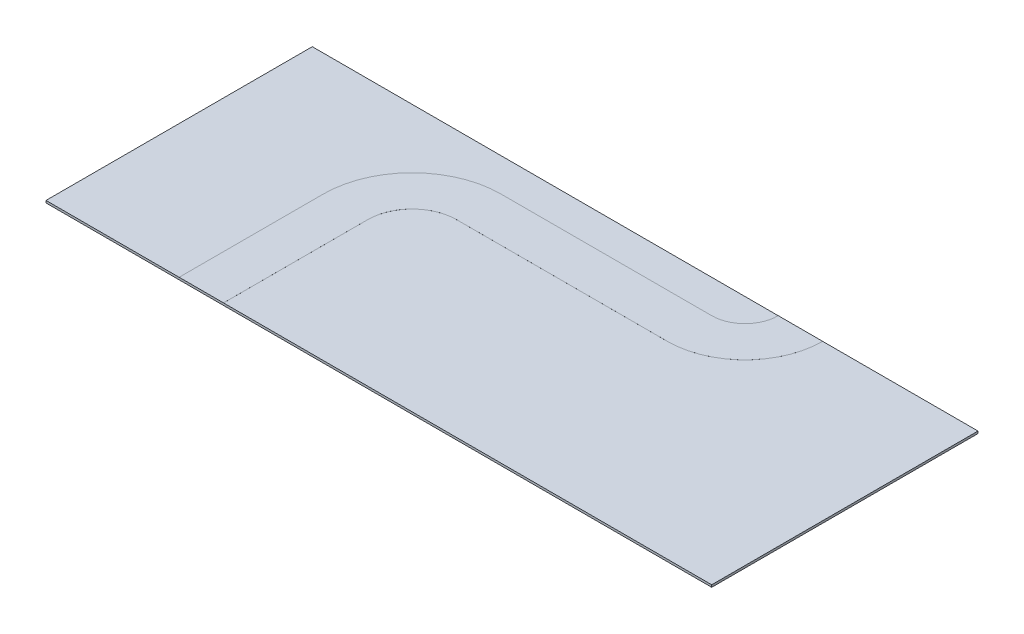
ISO-10303-21;
HEADER;
FILE_DESCRIPTION(('STEP AP214'),'2;1');
FILE_NAME('part.step','',(''),(''),'','','');
FILE_SCHEMA(('AUTOMOTIVE_DESIGN { 1 0 10303 214 1 1 1 1 }'));
ENDSEC;
DATA;
#1=APPLICATION_CONTEXT('core data for automotive mechanical design processes');
#2=APPLICATION_PROTOCOL_DEFINITION('international standard','automotive_design',2000,#1);
#3=PRODUCT_CONTEXT('',#1,'mechanical');
#4=PRODUCT('Part','Part','',(#3));
#5=PRODUCT_RELATED_PRODUCT_CATEGORY('part','',(#4));
#6=PRODUCT_DEFINITION_FORMATION('','',#4);
#7=PRODUCT_DEFINITION_CONTEXT('part definition',#1,'design');
#8=PRODUCT_DEFINITION('design','',#6,#7);
#9=PRODUCT_DEFINITION_SHAPE('','',#8);
#10=(LENGTH_UNIT() NAMED_UNIT(*) SI_UNIT(.MILLI.,.METRE.));
#11=(NAMED_UNIT(*) PLANE_ANGLE_UNIT() SI_UNIT($,.RADIAN.));
#12=(NAMED_UNIT(*) SI_UNIT($,.STERADIAN.) SOLID_ANGLE_UNIT());
#13=UNCERTAINTY_MEASURE_WITH_UNIT(LENGTH_MEASURE(1.E-05),#10,'distance_accuracy_value','');
#14=(GEOMETRIC_REPRESENTATION_CONTEXT(3) GLOBAL_UNCERTAINTY_ASSIGNED_CONTEXT((#13)) GLOBAL_UNIT_ASSIGNED_CONTEXT((#10,
#11,#12)) REPRESENTATION_CONTEXT('',''));
#15=CARTESIAN_POINT('',(0.,0.,0.));
#16=DIRECTION('',(0.,0.,1.));
#17=DIRECTION('',(1.,0.,0.));
#18=AXIS2_PLACEMENT_3D('',#15,#16,#17);
#19=CARTESIAN_POINT('',(0.,10.,0.));
#20=DIRECTION('',(0.,1.,0.));
#21=DIRECTION('',(0.,0.,1.));
#22=AXIS2_PLACEMENT_3D('',#19,#20,#21);
#23=PLANE('',#22);
#24=DIRECTION('',(0.,0.,1.));
#25=VECTOR('',#24,1.);
#26=CARTESIAN_POINT('',(-900.,10.,600.));
#27=LINE('',#26,#25);
#28=CARTESIAN_POINT('',(-900.,10.,-50.0000000000003));
#29=VERTEX_POINT('',#28);
#30=CARTESIAN_POINT('',(-900.,10.,600.));
#31=VERTEX_POINT('',#30);
#32=EDGE_CURVE('E48',#29,#31,#27,.T.);
#33=ORIENTED_EDGE('',*,*,#32,.F.);
#34=CARTESIAN_POINT('',(-500.,10.,-50.0000000000004));
#35=DIRECTION('',(0.,1.,0.));
#36=DIRECTION('',(0.,0.,-1.));
#37=AXIS2_PLACEMENT_3D('',#34,#35,#36);
#38=CIRCLE('',#37,400.);
#39=CARTESIAN_POINT('',(-500.,10.,-450.));
#40=VERTEX_POINT('',#39);
#41=EDGE_CURVE('E52',#40,#29,#38,.T.);
#42=ORIENTED_EDGE('',*,*,#41,.F.);
#43=DIRECTION('',(-1.,0.,0.));
#44=VECTOR('',#43,1.);
#45=CARTESIAN_POINT('',(-500.,10.,-450.));
#46=LINE('',#45,#44);
#47=CARTESIAN_POINT('',(450.,10.,-450.));
#48=VERTEX_POINT('',#47);
#49=EDGE_CURVE('E222',#48,#40,#46,.T.);
#50=ORIENTED_EDGE('',*,*,#49,.F.);
#51=CARTESIAN_POINT('',(450.,10.,-600.));
#52=DIRECTION('',(0.,-1.,0.));
#53=DIRECTION('',(0.,0.,1.));
#54=AXIS2_PLACEMENT_3D('',#51,#52,#53);
#55=CIRCLE('',#54,150.);
#56=CARTESIAN_POINT('',(600.,10.,-600.));
#57=VERTEX_POINT('',#56);
#58=EDGE_CURVE('E219',#57,#48,#55,.T.);
#59=ORIENTED_EDGE('',*,*,#58,.F.);
#60=DIRECTION('',(-1.,0.,0.));
#61=VECTOR('',#60,1.);
#62=CARTESIAN_POINT('',(-1500.,10.,-600.));
#63=LINE('',#62,#61);
#64=CARTESIAN_POINT('',(-1500.,10.,-600.));
#65=VERTEX_POINT('',#64);
#66=EDGE_CURVE('E169',#57,#65,#63,.T.);
#67=ORIENTED_EDGE('',*,*,#66,.T.);
#68=DIRECTION('',(0.,0.,1.));
#69=VECTOR('',#68,1.);
#70=CARTESIAN_POINT('',(-1500.,10.,-600.));
#71=LINE('',#70,#69);
#72=CARTESIAN_POINT('',(-1500.,10.,600.));
#73=VERTEX_POINT('',#72);
#74=EDGE_CURVE('E173',#65,#73,#71,.T.);
#75=ORIENTED_EDGE('',*,*,#74,.T.);
#76=DIRECTION('',(1.,0.,0.));
#77=VECTOR('',#76,1.);
#78=CARTESIAN_POINT('',(-1500.,10.,600.));
#79=LINE('',#78,#77);
#80=EDGE_CURVE('E175',#73,#31,#79,.T.);
#81=ORIENTED_EDGE('',*,*,#80,.T.);
#82=EDGE_LOOP('',(#33,#42,#50,#59,#67,#75,#81));
#83=FACE_BOUND('',#82,.T.);
#84=ADVANCED_FACE('F33',(#83),#23,.T.);
#85=CARTESIAN_POINT('',(1500.,10.,-600.));
#86=DIRECTION('',(-1.,0.,0.));
#87=DIRECTION('',(0.,0.,1.));
#88=AXIS2_PLACEMENT_3D('',#85,#86,#87);
#89=PLANE('',#88);
#90=DIRECTION('',(0.,0.,-1.));
#91=VECTOR('',#90,1.);
#92=CARTESIAN_POINT('',(1500.,0.,-600.));
#93=LINE('',#92,#91);
#94=CARTESIAN_POINT('',(1500.,0.,600.));
#95=VERTEX_POINT('',#94);
#96=CARTESIAN_POINT('',(1500.,0.,-600.));
#97=VERTEX_POINT('',#96);
#98=EDGE_CURVE('E157',#95,#97,#93,.T.);
#99=ORIENTED_EDGE('',*,*,#98,.T.);
#100=DIRECTION('',(0.,-1.,0.));
#101=VECTOR('',#100,1.);
#102=CARTESIAN_POINT('',(1500.,10.,-600.));
#103=LINE('',#102,#101);
#104=CARTESIAN_POINT('',(1500.,10.,-600.));
#105=VERTEX_POINT('',#104);
#106=EDGE_CURVE('E11',#105,#97,#103,.T.);
#107=ORIENTED_EDGE('',*,*,#106,.F.);
#108=DIRECTION('',(0.,0.,-1.));
#109=VECTOR('',#108,1.);
#110=CARTESIAN_POINT('',(1500.,10.,-600.));
#111=LINE('',#110,#109);
#112=CARTESIAN_POINT('',(1500.,10.,600.));
#113=VERTEX_POINT('',#112);
#114=EDGE_CURVE('E166',#113,#105,#111,.T.);
#115=ORIENTED_EDGE('',*,*,#114,.F.);
#116=DIRECTION('',(0.,-1.,0.));
#117=VECTOR('',#116,1.);
#118=CARTESIAN_POINT('',(1500.,10.,600.));
#119=LINE('',#118,#117);
#120=EDGE_CURVE('E176',#113,#95,#119,.T.);
#121=ORIENTED_EDGE('',*,*,#120,.T.);
#122=EDGE_LOOP('',(#99,#107,#115,#121));
#123=FACE_BOUND('',#122,.T.);
#124=ADVANCED_FACE('F35',(#123),#89,.F.);
#125=CARTESIAN_POINT('',(-1500.,10.,-600.));
#126=DIRECTION('',(0.,0.,1.));
#127=DIRECTION('',(1.,0.,0.));
#128=AXIS2_PLACEMENT_3D('',#125,#126,#127);
#129=PLANE('',#128);
#130=DIRECTION('',(-1.,0.,0.));
#131=VECTOR('',#130,1.);
#132=CARTESIAN_POINT('',(-1500.,0.,-600.));
#133=LINE('',#132,#131);
#134=CARTESIAN_POINT('',(-1500.,0.,-600.));
#135=VERTEX_POINT('',#134);
#136=EDGE_CURVE('E160',#97,#135,#133,.T.);
#137=ORIENTED_EDGE('',*,*,#136,.T.);
#138=DIRECTION('',(0.,-1.,0.));
#139=VECTOR('',#138,1.);
#140=CARTESIAN_POINT('',(-1500.,10.,-600.));
#141=LINE('',#140,#139);
#142=EDGE_CURVE('E41',#65,#135,#141,.T.);
#143=ORIENTED_EDGE('',*,*,#142,.F.);
#144=ORIENTED_EDGE('',*,*,#66,.F.);
#145=DIRECTION('',(0.,-1.,0.));
#146=VECTOR('',#145,1.);
#147=CARTESIAN_POINT('',(600.,10.1,-600.));
#148=LINE('',#147,#146);
#149=CARTESIAN_POINT('',(600.,10.1,-600.));
#150=VERTEX_POINT('',#149);
#151=EDGE_CURVE('E237',#150,#57,#148,.T.);
#152=ORIENTED_EDGE('',*,*,#151,.F.);
#153=DIRECTION('',(-1.,0.,0.));
#154=VECTOR('',#153,1.);
#155=CARTESIAN_POINT('',(800.,10.1,-600.));
#156=LINE('',#155,#154);
#157=CARTESIAN_POINT('',(800.,10.1,-600.));
#158=VERTEX_POINT('',#157);
#159=EDGE_CURVE('E259',#158,#150,#156,.T.);
#160=ORIENTED_EDGE('',*,*,#159,.F.);
#161=DIRECTION('',(0.,-1.,0.));
#162=VECTOR('',#161,1.);
#163=CARTESIAN_POINT('',(800.,10.1,-600.));
#164=LINE('',#163,#162);
#165=CARTESIAN_POINT('',(800.,10.,-600.));
#166=VERTEX_POINT('',#165);
#167=EDGE_CURVE('E240',#158,#166,#164,.T.);
#168=ORIENTED_EDGE('',*,*,#167,.T.);
#169=EDGE_CURVE('E171',#105,#166,#63,.T.);
#170=ORIENTED_EDGE('',*,*,#169,.F.);
#171=ORIENTED_EDGE('',*,*,#106,.T.);
#172=EDGE_LOOP('',(#137,#143,#144,#152,#160,#168,#170,#171));
#173=FACE_BOUND('',#172,.T.);
#174=ADVANCED_FACE('F274',(#173),#129,.F.);
#175=CARTESIAN_POINT('',(-1500.,10.,-600.));
#176=DIRECTION('',(1.,0.,0.));
#177=DIRECTION('',(0.,0.,-1.));
#178=AXIS2_PLACEMENT_3D('',#175,#176,#177);
#179=PLANE('',#178);
#180=DIRECTION('',(0.,0.,1.));
#181=VECTOR('',#180,1.);
#182=CARTESIAN_POINT('',(-1500.,0.,-600.));
#183=LINE('',#182,#181);
#184=CARTESIAN_POINT('',(-1500.,0.,600.));
#185=VERTEX_POINT('',#184);
#186=EDGE_CURVE('E179',#135,#185,#183,.T.);
#187=ORIENTED_EDGE('',*,*,#186,.T.);
#188=DIRECTION('',(0.,-1.,0.));
#189=VECTOR('',#188,1.);
#190=CARTESIAN_POINT('',(-1500.,10.,600.));
#191=LINE('',#190,#189);
#192=EDGE_CURVE('E184',#73,#185,#191,.T.);
#193=ORIENTED_EDGE('',*,*,#192,.F.);
#194=ORIENTED_EDGE('',*,*,#74,.F.);
#195=ORIENTED_EDGE('',*,*,#142,.T.);
#196=EDGE_LOOP('',(#187,#193,#194,#195));
#197=FACE_BOUND('',#196,.T.);
#198=ADVANCED_FACE('F191',(#197),#179,.F.);
#199=CARTESIAN_POINT('',(-1500.,10.,600.));
#200=DIRECTION('',(0.,0.,-1.));
#201=DIRECTION('',(-1.,0.,0.));
#202=AXIS2_PLACEMENT_3D('',#199,#200,#201);
#203=PLANE('',#202);
#204=DIRECTION('',(1.,0.,0.));
#205=VECTOR('',#204,1.);
#206=CARTESIAN_POINT('',(-1500.,0.,600.));
#207=LINE('',#206,#205);
#208=EDGE_CURVE('E170',#185,#95,#207,.T.);
#209=ORIENTED_EDGE('',*,*,#208,.T.);
#210=ORIENTED_EDGE('',*,*,#120,.F.);
#211=CARTESIAN_POINT('',(-700.,10.,600.));
#212=VERTEX_POINT('',#211);
#213=EDGE_CURVE('E156',#212,#113,#79,.T.);
#214=ORIENTED_EDGE('',*,*,#213,.F.);
#215=DIRECTION('',(0.,-1.,0.));
#216=VECTOR('',#215,1.);
#217=CARTESIAN_POINT('',(-700.,10.1,600.));
#218=LINE('',#217,#216);
#219=CARTESIAN_POINT('',(-700.,10.1,600.));
#220=VERTEX_POINT('',#219);
#221=EDGE_CURVE('E137',#220,#212,#218,.T.);
#222=ORIENTED_EDGE('',*,*,#221,.F.);
#223=DIRECTION('',(1.,0.,0.));
#224=VECTOR('',#223,1.);
#225=CARTESIAN_POINT('',(-700.,10.1,600.));
#226=LINE('',#225,#224);
#227=CARTESIAN_POINT('',(-900.,10.1,600.));
#228=VERTEX_POINT('',#227);
#229=EDGE_CURVE('E143',#228,#220,#226,.T.);
#230=ORIENTED_EDGE('',*,*,#229,.F.);
#231=DIRECTION('',(0.,-1.,0.));
#232=VECTOR('',#231,1.);
#233=CARTESIAN_POINT('',(-900.,10.1,600.));
#234=LINE('',#233,#232);
#235=EDGE_CURVE('E226',#228,#31,#234,.T.);
#236=ORIENTED_EDGE('',*,*,#235,.T.);
#237=ORIENTED_EDGE('',*,*,#80,.F.);
#238=ORIENTED_EDGE('',*,*,#192,.T.);
#239=EDGE_LOOP('',(#209,#210,#214,#222,#230,#236,#237,#238));
#240=FACE_BOUND('',#239,.T.);
#241=ADVANCED_FACE('F154',(#240),#203,.F.);
#242=CARTESIAN_POINT('',(450.,10.,-600.));
#243=DIRECTION('',(0.,1.,0.));
#244=DIRECTION('',(0.,0.,1.));
#245=AXIS2_PLACEMENT_3D('',#242,#243,#244);
#246=CIRCLE('',#245,350.);
#247=CARTESIAN_POINT('',(450.,10.,-250.));
#248=VERTEX_POINT('',#247);
#249=EDGE_CURVE('E217',#248,#166,#246,.T.);
#250=ORIENTED_EDGE('',*,*,#249,.F.);
#251=DIRECTION('',(1.,0.,0.));
#252=VECTOR('',#251,1.);
#253=CARTESIAN_POINT('',(-500.,10.,-250.));
#254=LINE('',#253,#252);
#255=CARTESIAN_POINT('',(-500.,10.,-250.));
#256=VERTEX_POINT('',#255);
#257=EDGE_CURVE('E210',#256,#248,#254,.T.);
#258=ORIENTED_EDGE('',*,*,#257,.F.);
#259=CARTESIAN_POINT('',(-500.,10.,-50.0000000000004));
#260=DIRECTION('',(0.,-1.,0.));
#261=DIRECTION('',(0.,0.,-1.));
#262=AXIS2_PLACEMENT_3D('',#259,#260,#261);
#263=CIRCLE('',#262,200.);
#264=CARTESIAN_POINT('',(-700.,10.,-50.0000000000004));
#265=VERTEX_POINT('',#264);
#266=EDGE_CURVE('E208',#265,#256,#263,.T.);
#267=ORIENTED_EDGE('',*,*,#266,.F.);
#268=DIRECTION('',(0.,0.,-1.));
#269=VECTOR('',#268,1.);
#270=CARTESIAN_POINT('',(-700.,10.,600.));
#271=LINE('',#270,#269);
#272=EDGE_CURVE('E206',#212,#265,#271,.T.);
#273=ORIENTED_EDGE('',*,*,#272,.F.);
#274=ORIENTED_EDGE('',*,*,#213,.T.);
#275=ORIENTED_EDGE('',*,*,#114,.T.);
#276=ORIENTED_EDGE('',*,*,#169,.T.);
#277=EDGE_LOOP('',(#250,#258,#267,#273,#274,#275,#276));
#278=FACE_BOUND('',#277,.T.);
#279=ADVANCED_FACE('F204',(#278),#23,.T.);
#280=CARTESIAN_POINT('',(0.,0.,0.));
#281=DIRECTION('',(0.,1.,0.));
#282=DIRECTION('',(0.,0.,1.));
#283=AXIS2_PLACEMENT_3D('',#280,#281,#282);
#284=PLANE('',#283);
#285=ORIENTED_EDGE('',*,*,#98,.F.);
#286=ORIENTED_EDGE('',*,*,#208,.F.);
#287=ORIENTED_EDGE('',*,*,#186,.F.);
#288=ORIENTED_EDGE('',*,*,#136,.F.);
#289=EDGE_LOOP('',(#285,#286,#287,#288));
#290=FACE_BOUND('',#289,.T.);
#291=ADVANCED_FACE('F198',(#290),#284,.F.);
#292=CARTESIAN_POINT('',(-700.,10.1,600.));
#293=DIRECTION('',(-1.,0.,0.));
#294=DIRECTION('',(0.,0.,1.));
#295=AXIS2_PLACEMENT_3D('',#292,#293,#294);
#296=PLANE('',#295);
#297=ORIENTED_EDGE('',*,*,#272,.T.);
#298=DIRECTION('',(0.,-1.,0.));
#299=VECTOR('',#298,1.);
#300=CARTESIAN_POINT('',(-700.,10.1,-50.0000000000004));
#301=LINE('',#300,#299);
#302=CARTESIAN_POINT('',(-700.,10.1,-50.0000000000004));
#303=VERTEX_POINT('',#302);
#304=EDGE_CURVE('E139',#303,#265,#301,.T.);
#305=ORIENTED_EDGE('',*,*,#304,.F.);
#306=DIRECTION('',(0.,0.,-1.));
#307=VECTOR('',#306,1.);
#308=CARTESIAN_POINT('',(-700.,10.1,600.));
#309=LINE('',#308,#307);
#310=EDGE_CURVE('E132',#220,#303,#309,.T.);
#311=ORIENTED_EDGE('',*,*,#310,.F.);
#312=ORIENTED_EDGE('',*,*,#221,.T.);
#313=EDGE_LOOP('',(#297,#305,#311,#312));
#314=FACE_BOUND('',#313,.T.);
#315=ADVANCED_FACE('F135',(#314),#296,.F.);
#316=CARTESIAN_POINT('',(-500.,10.1,-50.0000000000004));
#317=DIRECTION('',(0.,-1.,0.));
#318=DIRECTION('',(0.,0.,-1.));
#319=AXIS2_PLACEMENT_3D('',#316,#317,#318);
#320=CYLINDRICAL_SURFACE('',#319,200.);
#321=ORIENTED_EDGE('',*,*,#266,.T.);
#322=DIRECTION('',(0.,-1.,0.));
#323=VECTOR('',#322,1.);
#324=CARTESIAN_POINT('',(-500.,10.1,-250.));
#325=LINE('',#324,#323);
#326=CARTESIAN_POINT('',(-500.,10.1,-250.));
#327=VERTEX_POINT('',#326);
#328=EDGE_CURVE('E162',#327,#256,#325,.T.);
#329=ORIENTED_EDGE('',*,*,#328,.F.);
#330=CARTESIAN_POINT('',(-500.,10.1,-50.0000000000004));
#331=DIRECTION('',(0.,-1.,0.));
#332=DIRECTION('',(0.,0.,-1.));
#333=AXIS2_PLACEMENT_3D('',#330,#331,#332);
#334=CIRCLE('',#333,200.);
#335=EDGE_CURVE('E142',#303,#327,#334,.T.);
#336=ORIENTED_EDGE('',*,*,#335,.F.);
#337=ORIENTED_EDGE('',*,*,#304,.T.);
#338=EDGE_LOOP('',(#321,#329,#336,#337));
#339=FACE_BOUND('',#338,.T.);
#340=ADVANCED_FACE('F253',(#339),#320,.F.);
#341=CARTESIAN_POINT('',(-500.,10.1,-250.));
#342=DIRECTION('',(0.,0.,-1.));
#343=DIRECTION('',(-1.,0.,0.));
#344=AXIS2_PLACEMENT_3D('',#341,#342,#343);
#345=PLANE('',#344);
#346=ORIENTED_EDGE('',*,*,#257,.T.);
#347=DIRECTION('',(0.,-1.,0.));
#348=VECTOR('',#347,1.);
#349=CARTESIAN_POINT('',(450.,10.1,-250.));
#350=LINE('',#349,#348);
#351=CARTESIAN_POINT('',(450.,10.1,-250.));
#352=VERTEX_POINT('',#351);
#353=EDGE_CURVE('E243',#352,#248,#350,.T.);
#354=ORIENTED_EDGE('',*,*,#353,.F.);
#355=DIRECTION('',(1.,0.,0.));
#356=VECTOR('',#355,1.);
#357=CARTESIAN_POINT('',(-500.,10.1,-250.));
#358=LINE('',#357,#356);
#359=EDGE_CURVE('E251',#327,#352,#358,.T.);
#360=ORIENTED_EDGE('',*,*,#359,.F.);
#361=ORIENTED_EDGE('',*,*,#328,.T.);
#362=EDGE_LOOP('',(#346,#354,#360,#361));
#363=FACE_BOUND('',#362,.T.);
#364=ADVANCED_FACE('F249',(#363),#345,.F.);
#365=CARTESIAN_POINT('',(450.,10.1,-600.));
#366=DIRECTION('',(0.,-1.,0.));
#367=DIRECTION('',(0.,0.,-1.));
#368=AXIS2_PLACEMENT_3D('',#365,#366,#367);
#369=CYLINDRICAL_SURFACE('',#368,350.);
#370=ORIENTED_EDGE('',*,*,#249,.T.);
#371=ORIENTED_EDGE('',*,*,#167,.F.);
#372=CARTESIAN_POINT('',(450.,10.1,-600.));
#373=DIRECTION('',(0.,1.,0.));
#374=DIRECTION('',(0.,0.,1.));
#375=AXIS2_PLACEMENT_3D('',#372,#373,#374);
#376=CIRCLE('',#375,350.);
#377=EDGE_CURVE('E255',#352,#158,#376,.T.);
#378=ORIENTED_EDGE('',*,*,#377,.F.);
#379=ORIENTED_EDGE('',*,*,#353,.T.);
#380=EDGE_LOOP('',(#370,#371,#378,#379));
#381=FACE_BOUND('',#380,.T.);
#382=ADVANCED_FACE('F283',(#381),#369,.T.);
#383=CARTESIAN_POINT('',(450.,10.1,-600.));
#384=DIRECTION('',(0.,-1.,0.));
#385=DIRECTION('',(0.,0.,-1.));
#386=AXIS2_PLACEMENT_3D('',#383,#384,#385);
#387=CYLINDRICAL_SURFACE('',#386,150.);
#388=ORIENTED_EDGE('',*,*,#58,.T.);
#389=DIRECTION('',(0.,-1.,0.));
#390=VECTOR('',#389,1.);
#391=CARTESIAN_POINT('',(450.,10.1,-450.));
#392=LINE('',#391,#390);
#393=CARTESIAN_POINT('',(450.,10.1,-450.));
#394=VERTEX_POINT('',#393);
#395=EDGE_CURVE('E234',#394,#48,#392,.T.);
#396=ORIENTED_EDGE('',*,*,#395,.F.);
#397=CARTESIAN_POINT('',(450.,10.1,-600.));
#398=DIRECTION('',(0.,-1.,0.));
#399=DIRECTION('',(0.,0.,1.));
#400=AXIS2_PLACEMENT_3D('',#397,#398,#399);
#401=CIRCLE('',#400,150.);
#402=EDGE_CURVE('E261',#150,#394,#401,.T.);
#403=ORIENTED_EDGE('',*,*,#402,.F.);
#404=ORIENTED_EDGE('',*,*,#151,.T.);
#405=EDGE_LOOP('',(#388,#396,#403,#404));
#406=FACE_BOUND('',#405,.T.);
#407=ADVANCED_FACE('F278',(#406),#387,.F.);
#408=CARTESIAN_POINT('',(-500.,10.1,-450.));
#409=DIRECTION('',(0.,0.,1.));
#410=DIRECTION('',(1.,0.,0.));
#411=AXIS2_PLACEMENT_3D('',#408,#409,#410);
#412=PLANE('',#411);
#413=ORIENTED_EDGE('',*,*,#49,.T.);
#414=DIRECTION('',(0.,-1.,0.));
#415=VECTOR('',#414,1.);
#416=CARTESIAN_POINT('',(-500.,10.1,-450.));
#417=LINE('',#416,#415);
#418=CARTESIAN_POINT('',(-500.,10.1,-450.));
#419=VERTEX_POINT('',#418);
#420=EDGE_CURVE('E231',#419,#40,#417,.T.);
#421=ORIENTED_EDGE('',*,*,#420,.F.);
#422=DIRECTION('',(-1.,0.,0.));
#423=VECTOR('',#422,1.);
#424=CARTESIAN_POINT('',(-500.,10.1,-450.));
#425=LINE('',#424,#423);
#426=EDGE_CURVE('E263',#394,#419,#425,.T.);
#427=ORIENTED_EDGE('',*,*,#426,.F.);
#428=ORIENTED_EDGE('',*,*,#395,.T.);
#429=EDGE_LOOP('',(#413,#421,#427,#428));
#430=FACE_BOUND('',#429,.T.);
#431=ADVANCED_FACE('F290',(#430),#412,.F.);
#432=CARTESIAN_POINT('',(-500.,10.1,-50.0000000000004));
#433=DIRECTION('',(0.,-1.,0.));
#434=DIRECTION('',(0.,0.,-1.));
#435=AXIS2_PLACEMENT_3D('',#432,#433,#434);
#436=CYLINDRICAL_SURFACE('',#435,400.);
#437=ORIENTED_EDGE('',*,*,#41,.T.);
#438=DIRECTION('',(0.,-1.,0.));
#439=VECTOR('',#438,1.);
#440=CARTESIAN_POINT('',(-900.,10.1,-50.0000000000003));
#441=LINE('',#440,#439);
#442=CARTESIAN_POINT('',(-900.,10.1,-50.0000000000003));
#443=VERTEX_POINT('',#442);
#444=EDGE_CURVE('E228',#443,#29,#441,.T.);
#445=ORIENTED_EDGE('',*,*,#444,.F.);
#446=CARTESIAN_POINT('',(-500.,10.1,-50.0000000000004));
#447=DIRECTION('',(0.,1.,0.));
#448=DIRECTION('',(0.,0.,-1.));
#449=AXIS2_PLACEMENT_3D('',#446,#447,#448);
#450=CIRCLE('',#449,400.);
#451=EDGE_CURVE('E264',#419,#443,#450,.T.);
#452=ORIENTED_EDGE('',*,*,#451,.F.);
#453=ORIENTED_EDGE('',*,*,#420,.T.);
#454=EDGE_LOOP('',(#437,#445,#452,#453));
#455=FACE_BOUND('',#454,.T.);
#456=ADVANCED_FACE('F270',(#455),#436,.T.);
#457=CARTESIAN_POINT('',(-900.,10.1,600.));
#458=DIRECTION('',(1.,0.,0.));
#459=DIRECTION('',(0.,0.,-1.));
#460=AXIS2_PLACEMENT_3D('',#457,#458,#459);
#461=PLANE('',#460);
#462=ORIENTED_EDGE('',*,*,#32,.T.);
#463=ORIENTED_EDGE('',*,*,#235,.F.);
#464=DIRECTION('',(0.,0.,1.));
#465=VECTOR('',#464,1.);
#466=CARTESIAN_POINT('',(-900.,10.1,600.));
#467=LINE('',#466,#465);
#468=EDGE_CURVE('E148',#443,#228,#467,.T.);
#469=ORIENTED_EDGE('',*,*,#468,.F.);
#470=ORIENTED_EDGE('',*,*,#444,.T.);
#471=EDGE_LOOP('',(#462,#463,#469,#470));
#472=FACE_BOUND('',#471,.T.);
#473=ADVANCED_FACE('F272',(#472),#461,.F.);
#474=CARTESIAN_POINT('',(-500.,10.1,-50.0000000000004));
#475=DIRECTION('',(0.,-1.,0.));
#476=DIRECTION('',(0.,0.,-1.));
#477=AXIS2_PLACEMENT_3D('',#474,#475,#476);
#478=PLANE('',#477);
#479=ORIENTED_EDGE('',*,*,#229,.T.);
#480=ORIENTED_EDGE('',*,*,#310,.T.);
#481=ORIENTED_EDGE('',*,*,#335,.T.);
#482=ORIENTED_EDGE('',*,*,#359,.T.);
#483=ORIENTED_EDGE('',*,*,#377,.T.);
#484=ORIENTED_EDGE('',*,*,#159,.T.);
#485=ORIENTED_EDGE('',*,*,#402,.T.);
#486=ORIENTED_EDGE('',*,*,#426,.T.);
#487=ORIENTED_EDGE('',*,*,#451,.T.);
#488=ORIENTED_EDGE('',*,*,#468,.T.);
#489=EDGE_LOOP('',(#479,#480,#481,#482,#483,#484,#485,#486,#487,#488));
#490=FACE_BOUND('',#489,.T.);
#491=ADVANCED_FACE('F146',(#490),#478,.F.);
#492=CLOSED_SHELL('',(#84,#124,#174,#198,#241,#279,#291,#315,#340,#364,#382,#407,#431,#456,#473,#491));
#493=MANIFOLD_SOLID_BREP('B2',#492);
#494=ADVANCED_BREP_SHAPE_REPRESENTATION('',(#18,#493),#14);
#495=SHAPE_DEFINITION_REPRESENTATION(#9,#494);
ENDSEC;
END-ISO-10303-21;
